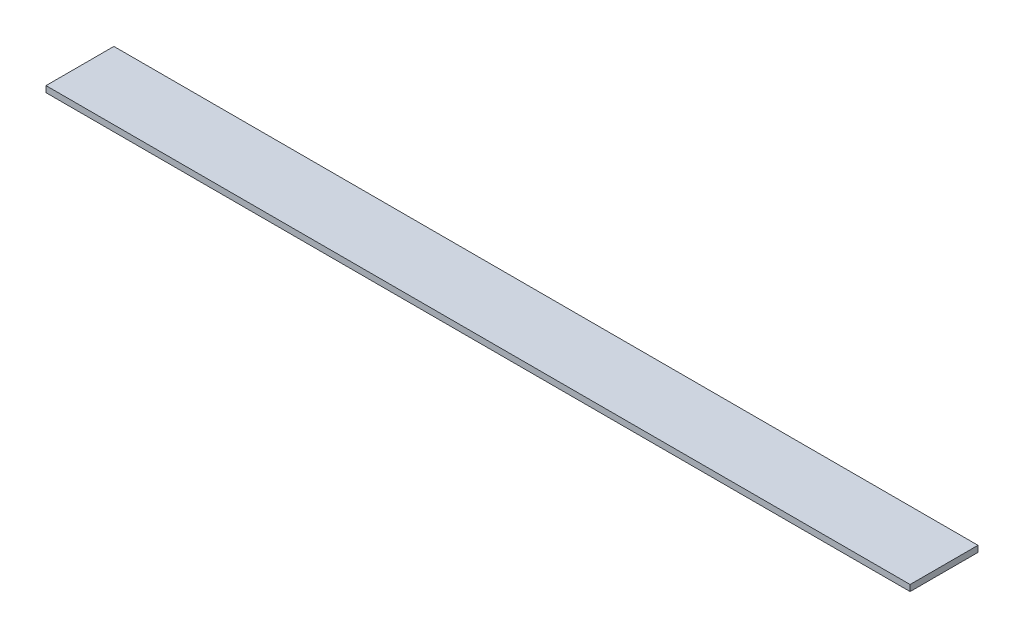
ISO-10303-21;
HEADER;
FILE_DESCRIPTION(('STEP AP214'),'2;1');
FILE_NAME('part.step','',(''),(''),'','','');
FILE_SCHEMA(('AUTOMOTIVE_DESIGN { 1 0 10303 214 1 1 1 1 }'));
ENDSEC;
DATA;
#1=APPLICATION_CONTEXT('core data for automotive mechanical design processes');
#2=APPLICATION_PROTOCOL_DEFINITION('international standard','automotive_design',2000,#1);
#3=PRODUCT_CONTEXT('',#1,'mechanical');
#4=PRODUCT('Part','Part','',(#3));
#5=PRODUCT_RELATED_PRODUCT_CATEGORY('part','',(#4));
#6=PRODUCT_DEFINITION_FORMATION('','',#4);
#7=PRODUCT_DEFINITION_CONTEXT('part definition',#1,'design');
#8=PRODUCT_DEFINITION('design','',#6,#7);
#9=PRODUCT_DEFINITION_SHAPE('','',#8);
#10=(LENGTH_UNIT() NAMED_UNIT(*) SI_UNIT(.MILLI.,.METRE.));
#11=(NAMED_UNIT(*) PLANE_ANGLE_UNIT() SI_UNIT($,.RADIAN.));
#12=(NAMED_UNIT(*) SI_UNIT($,.STERADIAN.) SOLID_ANGLE_UNIT());
#13=UNCERTAINTY_MEASURE_WITH_UNIT(LENGTH_MEASURE(1.E-05),#10,'distance_accuracy_value','');
#14=(GEOMETRIC_REPRESENTATION_CONTEXT(3) GLOBAL_UNCERTAINTY_ASSIGNED_CONTEXT((#13)) GLOBAL_UNIT_ASSIGNED_CONTEXT((#10,
#11,#12)) REPRESENTATION_CONTEXT('',''));
#15=CARTESIAN_POINT('',(0.,0.,0.));
#16=DIRECTION('',(0.,0.,1.));
#17=DIRECTION('',(1.,0.,0.));
#18=AXIS2_PLACEMENT_3D('',#15,#16,#17);
#19=CARTESIAN_POINT('',(1400.,0.,0.));
#20=DIRECTION('',(0.,0.,-1.));
#21=DIRECTION('',(0.,1.,0.));
#22=AXIS2_PLACEMENT_3D('',#19,#20,#21);
#23=PLANE('',#22);
#24=DIRECTION('',(0.,-1.,0.));
#25=VECTOR('',#24,1.);
#26=CARTESIAN_POINT('',(0.,0.,0.));
#27=LINE('',#26,#25);
#28=CARTESIAN_POINT('',(0.,0.,0.));
#29=VERTEX_POINT('',#28);
#30=CARTESIAN_POINT('',(0.,-10.,0.));
#31=VERTEX_POINT('',#30);
#32=EDGE_CURVE('E107',#29,#31,#27,.T.);
#33=ORIENTED_EDGE('',*,*,#32,.T.);
#34=DIRECTION('',(-1.,0.,0.));
#35=VECTOR('',#34,1.);
#36=CARTESIAN_POINT('',(1400.,-10.,0.));
#37=LINE('',#36,#35);
#38=CARTESIAN_POINT('',(1400.,-10.,0.));
#39=VERTEX_POINT('',#38);
#40=EDGE_CURVE('E11',#39,#31,#37,.T.);
#41=ORIENTED_EDGE('',*,*,#40,.F.);
#42=DIRECTION('',(0.,-1.,0.));
#43=VECTOR('',#42,1.);
#44=CARTESIAN_POINT('',(1400.,0.,0.));
#45=LINE('',#44,#43);
#46=CARTESIAN_POINT('',(1400.,0.,0.));
#47=VERTEX_POINT('',#46);
#48=EDGE_CURVE('E89',#47,#39,#45,.T.);
#49=ORIENTED_EDGE('',*,*,#48,.F.);
#50=DIRECTION('',(-1.,0.,0.));
#51=VECTOR('',#50,1.);
#52=CARTESIAN_POINT('',(1400.,0.,0.));
#53=LINE('',#52,#51);
#54=EDGE_CURVE('E56',#47,#29,#53,.T.);
#55=ORIENTED_EDGE('',*,*,#54,.T.);
#56=EDGE_LOOP('',(#33,#41,#49,#55));
#57=FACE_BOUND('',#56,.T.);
#58=ADVANCED_FACE('F39',(#57),#23,.F.);
#59=CARTESIAN_POINT('',(1400.,-10.,0.));
#60=DIRECTION('',(0.,1.,0.));
#61=DIRECTION('',(0.,0.,1.));
#62=AXIS2_PLACEMENT_3D('',#59,#60,#61);
#63=PLANE('',#62);
#64=DIRECTION('',(0.,0.,-1.));
#65=VECTOR('',#64,1.);
#66=CARTESIAN_POINT('',(0.,-10.,0.));
#67=LINE('',#66,#65);
#68=CARTESIAN_POINT('',(0.,-10.,-110.));
#69=VERTEX_POINT('',#68);
#70=EDGE_CURVE('E95',#31,#69,#67,.T.);
#71=ORIENTED_EDGE('',*,*,#70,.T.);
#72=DIRECTION('',(-1.,0.,0.));
#73=VECTOR('',#72,1.);
#74=CARTESIAN_POINT('',(1400.,-10.,-110.));
#75=LINE('',#74,#73);
#76=CARTESIAN_POINT('',(1400.,-10.,-110.));
#77=VERTEX_POINT('',#76);
#78=EDGE_CURVE('E48',#77,#69,#75,.T.);
#79=ORIENTED_EDGE('',*,*,#78,.F.);
#80=DIRECTION('',(0.,0.,-1.));
#81=VECTOR('',#80,1.);
#82=CARTESIAN_POINT('',(1400.,-10.,0.));
#83=LINE('',#82,#81);
#84=EDGE_CURVE('E81',#39,#77,#83,.T.);
#85=ORIENTED_EDGE('',*,*,#84,.F.);
#86=ORIENTED_EDGE('',*,*,#40,.T.);
#87=EDGE_LOOP('',(#71,#79,#85,#86));
#88=FACE_BOUND('',#87,.T.);
#89=ADVANCED_FACE('F94',(#88),#63,.F.);
#90=CARTESIAN_POINT('',(1400.,0.,-110.));
#91=DIRECTION('',(0.,0.,-1.));
#92=DIRECTION('',(-1.,0.,0.));
#93=AXIS2_PLACEMENT_3D('',#90,#91,#92);
#94=PLANE('',#93);
#95=DIRECTION('',(0.,-1.,0.));
#96=VECTOR('',#95,1.);
#97=CARTESIAN_POINT('',(0.,0.,-110.));
#98=LINE('',#97,#96);
#99=CARTESIAN_POINT('',(0.,0.,-110.));
#100=VERTEX_POINT('',#99);
#101=EDGE_CURVE('E112',#100,#69,#98,.T.);
#102=ORIENTED_EDGE('',*,*,#101,.F.);
#103=DIRECTION('',(-1.,0.,0.));
#104=VECTOR('',#103,1.);
#105=CARTESIAN_POINT('',(1400.,0.,-110.));
#106=LINE('',#105,#104);
#107=CARTESIAN_POINT('',(1400.,0.,-110.));
#108=VERTEX_POINT('',#107);
#109=EDGE_CURVE('E70',#108,#100,#106,.T.);
#110=ORIENTED_EDGE('',*,*,#109,.F.);
#111=DIRECTION('',(0.,-1.,0.));
#112=VECTOR('',#111,1.);
#113=CARTESIAN_POINT('',(1400.,0.,-110.));
#114=LINE('',#113,#112);
#115=EDGE_CURVE('E88',#108,#77,#114,.T.);
#116=ORIENTED_EDGE('',*,*,#115,.T.);
#117=ORIENTED_EDGE('',*,*,#78,.T.);
#118=EDGE_LOOP('',(#102,#110,#116,#117));
#119=FACE_BOUND('',#118,.T.);
#120=ADVANCED_FACE('F99',(#119),#94,.T.);
#121=CARTESIAN_POINT('',(1400.,0.,0.));
#122=DIRECTION('',(0.,1.,0.));
#123=DIRECTION('',(0.,0.,1.));
#124=AXIS2_PLACEMENT_3D('',#121,#122,#123);
#125=PLANE('',#124);
#126=DIRECTION('',(0.,0.,-1.));
#127=VECTOR('',#126,1.);
#128=CARTESIAN_POINT('',(0.,0.,0.));
#129=LINE('',#128,#127);
#130=EDGE_CURVE('E115',#29,#100,#129,.T.);
#131=ORIENTED_EDGE('',*,*,#130,.F.);
#132=ORIENTED_EDGE('',*,*,#54,.F.);
#133=DIRECTION('',(0.,0.,-1.));
#134=VECTOR('',#133,1.);
#135=CARTESIAN_POINT('',(1400.,0.,0.));
#136=LINE('',#135,#134);
#137=EDGE_CURVE('E101',#47,#108,#136,.T.);
#138=ORIENTED_EDGE('',*,*,#137,.T.);
#139=ORIENTED_EDGE('',*,*,#109,.T.);
#140=EDGE_LOOP('',(#131,#132,#138,#139));
#141=FACE_BOUND('',#140,.T.);
#142=ADVANCED_FACE('F125',(#141),#125,.T.);
#143=CARTESIAN_POINT('',(1400.,0.,0.));
#144=DIRECTION('',(1.,0.,0.));
#145=DIRECTION('',(0.,0.,-1.));
#146=AXIS2_PLACEMENT_3D('',#143,#144,#145);
#147=PLANE('',#146);
#148=ORIENTED_EDGE('',*,*,#48,.T.);
#149=ORIENTED_EDGE('',*,*,#84,.T.);
#150=ORIENTED_EDGE('',*,*,#115,.F.);
#151=ORIENTED_EDGE('',*,*,#137,.F.);
#152=EDGE_LOOP('',(#148,#149,#150,#151));
#153=FACE_BOUND('',#152,.T.);
#154=ADVANCED_FACE('F85',(#153),#147,.T.);
#155=CARTESIAN_POINT('',(0.,0.,0.));
#156=DIRECTION('',(1.,0.,0.));
#157=DIRECTION('',(0.,0.,-1.));
#158=AXIS2_PLACEMENT_3D('',#155,#156,#157);
#159=PLANE('',#158);
#160=ORIENTED_EDGE('',*,*,#32,.F.);
#161=ORIENTED_EDGE('',*,*,#130,.T.);
#162=ORIENTED_EDGE('',*,*,#101,.T.);
#163=ORIENTED_EDGE('',*,*,#70,.F.);
#164=EDGE_LOOP('',(#160,#161,#162,#163));
#165=FACE_BOUND('',#164,.T.);
#166=ADVANCED_FACE('F124',(#165),#159,.F.);
#167=CLOSED_SHELL('',(#58,#89,#120,#142,#154,#166));
#168=MANIFOLD_SOLID_BREP('B2',#167);
#169=ADVANCED_BREP_SHAPE_REPRESENTATION('',(#18,#168),#14);
#170=SHAPE_DEFINITION_REPRESENTATION(#9,#169);
ENDSEC;
END-ISO-10303-21;
